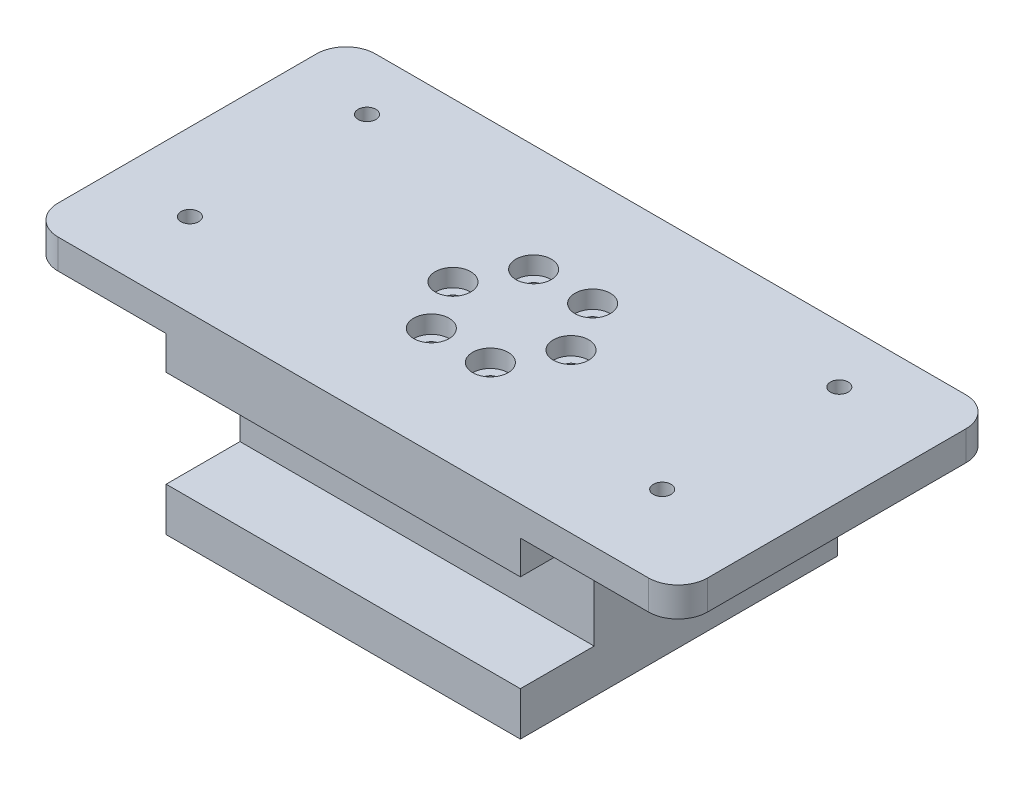
ISO-10303-21;
HEADER;
FILE_DESCRIPTION(('STEP AP214'),'2;1');
FILE_NAME('part.step','',(''),(''),'','','');
FILE_SCHEMA(('AUTOMOTIVE_DESIGN { 1 0 10303 214 1 1 1 1 }'));
ENDSEC;
DATA;
#1=APPLICATION_CONTEXT('core data for automotive mechanical design processes');
#2=APPLICATION_PROTOCOL_DEFINITION('international standard','automotive_design',2000,#1);
#3=PRODUCT_CONTEXT('',#1,'mechanical');
#4=PRODUCT('Part','Part','',(#3));
#5=PRODUCT_RELATED_PRODUCT_CATEGORY('part','',(#4));
#6=PRODUCT_DEFINITION_FORMATION('','',#4);
#7=PRODUCT_DEFINITION_CONTEXT('part definition',#1,'design');
#8=PRODUCT_DEFINITION('design','',#6,#7);
#9=PRODUCT_DEFINITION_SHAPE('','',#8);
#10=(LENGTH_UNIT() NAMED_UNIT(*) SI_UNIT(.MILLI.,.METRE.));
#11=(NAMED_UNIT(*) PLANE_ANGLE_UNIT() SI_UNIT($,.RADIAN.));
#12=(NAMED_UNIT(*) SI_UNIT($,.STERADIAN.) SOLID_ANGLE_UNIT());
#13=UNCERTAINTY_MEASURE_WITH_UNIT(LENGTH_MEASURE(1.E-05),#10,'distance_accuracy_value','');
#14=(GEOMETRIC_REPRESENTATION_CONTEXT(3) GLOBAL_UNCERTAINTY_ASSIGNED_CONTEXT((#13)) GLOBAL_UNIT_ASSIGNED_CONTEXT((#10,
#11,#12)) REPRESENTATION_CONTEXT('',''));
#15=CARTESIAN_POINT('',(0.,0.,0.));
#16=DIRECTION('',(0.,0.,1.));
#17=DIRECTION('',(1.,0.,0.));
#18=AXIS2_PLACEMENT_3D('',#15,#16,#17);
#19=CARTESIAN_POINT('',(0.,29.5,0.));
#20=DIRECTION('',(0.,0.,-1.));
#21=DIRECTION('',(-1.,0.,0.));
#22=AXIS2_PLACEMENT_3D('',#19,#20,#21);
#23=PLANE('',#22);
#24=DIRECTION('',(0.,-1.,0.));
#25=VECTOR('',#24,1.);
#26=CARTESIAN_POINT('',(60.0000000000001,29.5,0.));
#27=LINE('',#26,#25);
#28=CARTESIAN_POINT('',(60.0000000000001,7.40000000000001,0.));
#29=VERTEX_POINT('',#28);
#30=CARTESIAN_POINT('',(60.0000000000001,0.,0.));
#31=VERTEX_POINT('',#30);
#32=EDGE_CURVE('E300',#29,#31,#27,.T.);
#33=ORIENTED_EDGE('',*,*,#32,.F.);
#34=DIRECTION('',(-1.,0.,0.));
#35=VECTOR('',#34,1.);
#36=CARTESIAN_POINT('',(86.7070076840914,7.40000000000001,0.));
#37=LINE('',#36,#35);
#38=CARTESIAN_POINT('',(0.,7.40000000000001,0.));
#39=VERTEX_POINT('',#38);
#40=EDGE_CURVE('E329',#29,#39,#37,.T.);
#41=ORIENTED_EDGE('',*,*,#40,.T.);
#42=DIRECTION('',(0.,-1.,0.));
#43=VECTOR('',#42,1.);
#44=CARTESIAN_POINT('',(0.,29.5,0.));
#45=LINE('',#44,#43);
#46=CARTESIAN_POINT('',(0.,0.,0.));
#47=VERTEX_POINT('',#46);
#48=EDGE_CURVE('E189',#39,#47,#45,.T.);
#49=ORIENTED_EDGE('',*,*,#48,.T.);
#50=DIRECTION('',(1.,0.,0.));
#51=VECTOR('',#50,1.);
#52=CARTESIAN_POINT('',(0.,0.,0.));
#53=LINE('',#52,#51);
#54=EDGE_CURVE('E290',#47,#31,#53,.T.);
#55=ORIENTED_EDGE('',*,*,#54,.T.);
#56=EDGE_LOOP('',(#33,#41,#49,#55));
#57=FACE_BOUND('',#56,.T.);
#58=ADVANCED_FACE('F45',(#57),#23,.F.);
#59=CARTESIAN_POINT('',(0.,29.5,0.));
#60=DIRECTION('',(1.,0.,0.));
#61=DIRECTION('',(0.,0.,-1.));
#62=AXIS2_PLACEMENT_3D('',#59,#60,#61);
#63=PLANE('',#62);
#64=ORIENTED_EDGE('',*,*,#48,.F.);
#65=DIRECTION('',(0.,0.,1.));
#66=VECTOR('',#65,1.);
#67=CARTESIAN_POINT('',(0.,7.40000000000001,0.));
#68=LINE('',#67,#66);
#69=CARTESIAN_POINT('',(0.,7.4,-12.5));
#70=VERTEX_POINT('',#69);
#71=EDGE_CURVE('E170',#70,#39,#68,.T.);
#72=ORIENTED_EDGE('',*,*,#71,.F.);
#73=DIRECTION('',(0.,-1.,0.));
#74=VECTOR('',#73,1.);
#75=CARTESIAN_POINT('',(0.,23.8,-12.5));
#76=LINE('',#75,#74);
#77=CARTESIAN_POINT('',(0.,23.8,-12.5));
#78=VERTEX_POINT('',#77);
#79=EDGE_CURVE('E181',#78,#70,#76,.T.);
#80=ORIENTED_EDGE('',*,*,#79,.F.);
#81=DIRECTION('',(0.,0.,-1.));
#82=VECTOR('',#81,1.);
#83=CARTESIAN_POINT('',(0.,23.8,0.));
#84=LINE('',#83,#82);
#85=CARTESIAN_POINT('',(0.,23.8,0.));
#86=VERTEX_POINT('',#85);
#87=EDGE_CURVE('E162',#86,#78,#84,.T.);
#88=ORIENTED_EDGE('',*,*,#87,.F.);
#89=CARTESIAN_POINT('',(0.,29.5,0.));
#90=VERTEX_POINT('',#89);
#91=EDGE_CURVE('E177',#90,#86,#45,.T.);
#92=ORIENTED_EDGE('',*,*,#91,.F.);
#93=DIRECTION('',(0.,0.,1.));
#94=VECTOR('',#93,1.);
#95=CARTESIAN_POINT('',(0.,29.5,0.));
#96=LINE('',#95,#94);
#97=CARTESIAN_POINT('',(0.,29.5,-53.75));
#98=VERTEX_POINT('',#97);
#99=EDGE_CURVE('E268',#98,#90,#96,.T.);
#100=ORIENTED_EDGE('',*,*,#99,.F.);
#101=DIRECTION('',(0.,-1.,0.));
#102=VECTOR('',#101,1.);
#103=CARTESIAN_POINT('',(0.,29.5,-53.75));
#104=LINE('',#103,#102);
#105=CARTESIAN_POINT('',(0.,0.,-53.75));
#106=VERTEX_POINT('',#105);
#107=EDGE_CURVE('E286',#98,#106,#104,.T.);
#108=ORIENTED_EDGE('',*,*,#107,.T.);
#109=DIRECTION('',(0.,0.,1.));
#110=VECTOR('',#109,1.);
#111=CARTESIAN_POINT('',(0.,0.,0.));
#112=LINE('',#111,#110);
#113=EDGE_CURVE('E287',#106,#47,#112,.T.);
#114=ORIENTED_EDGE('',*,*,#113,.T.);
#115=EDGE_LOOP('',(#64,#72,#80,#88,#92,#100,#108,#114));
#116=FACE_BOUND('',#115,.T.);
#117=ADVANCED_FACE('F175',(#116),#63,.F.);
#118=DIRECTION('',(1.,0.,0.));
#119=VECTOR('',#118,1.);
#120=CARTESIAN_POINT('',(-23.2929923159086,29.5,0.));
#121=LINE('',#120,#119);
#122=CARTESIAN_POINT('',(60.0000000000001,29.5,0.));
#123=VERTEX_POINT('',#122);
#124=CARTESIAN_POINT('',(81.7070076840914,29.5,0.));
#125=VERTEX_POINT('',#124);
#126=EDGE_CURVE('E270',#123,#125,#121,.T.);
#127=ORIENTED_EDGE('',*,*,#126,.T.);
#128=DIRECTION('',(0.,-1.,0.));
#129=VECTOR('',#128,1.);
#130=CARTESIAN_POINT('',(81.7070076840914,29.5,0.));
#131=LINE('',#130,#129);
#132=CARTESIAN_POINT('',(81.7070076840914,34.5,0.));
#133=VERTEX_POINT('',#132);
#134=EDGE_CURVE('E11',#125,#133,#131,.F.);
#135=ORIENTED_EDGE('',*,*,#134,.T.);
#136=DIRECTION('',(1.,0.,0.));
#137=VECTOR('',#136,1.);
#138=CARTESIAN_POINT('',(-23.2929923159086,34.5,0.));
#139=LINE('',#138,#137);
#140=CARTESIAN_POINT('',(-18.2929923159086,34.5,0.));
#141=VERTEX_POINT('',#140);
#142=EDGE_CURVE('E260',#141,#133,#139,.T.);
#143=ORIENTED_EDGE('',*,*,#142,.F.);
#144=DIRECTION('',(0.,-1.,0.));
#145=VECTOR('',#144,1.);
#146=CARTESIAN_POINT('',(-18.2929923159086,29.5,0.));
#147=LINE('',#146,#145);
#148=CARTESIAN_POINT('',(-18.2929923159086,29.5,0.));
#149=VERTEX_POINT('',#148);
#150=EDGE_CURVE('E53',#141,#149,#147,.T.);
#151=ORIENTED_EDGE('',*,*,#150,.T.);
#152=EDGE_CURVE('E188',#149,#90,#121,.T.);
#153=ORIENTED_EDGE('',*,*,#152,.T.);
#154=ORIENTED_EDGE('',*,*,#91,.T.);
#155=DIRECTION('',(-1.,0.,0.));
#156=VECTOR('',#155,1.);
#157=CARTESIAN_POINT('',(86.7070076840914,23.8,0.));
#158=LINE('',#157,#156);
#159=CARTESIAN_POINT('',(60.0000000000001,23.8,0.));
#160=VERTEX_POINT('',#159);
#161=EDGE_CURVE('E159',#160,#86,#158,.T.);
#162=ORIENTED_EDGE('',*,*,#161,.F.);
#163=EDGE_CURVE('E193',#123,#160,#27,.T.);
#164=ORIENTED_EDGE('',*,*,#163,.F.);
#165=EDGE_LOOP('',(#127,#135,#143,#151,#153,#154,#162,#164));
#166=FACE_BOUND('',#165,.T.);
#167=ADVANCED_FACE('F185',(#166),#23,.F.);
#168=CARTESIAN_POINT('',(60.0000000000001,29.5,0.));
#169=DIRECTION('',(-1.,0.,0.));
#170=DIRECTION('',(0.,0.,1.));
#171=AXIS2_PLACEMENT_3D('',#168,#169,#170);
#172=PLANE('',#171);
#173=DIRECTION('',(0.,-1.,0.));
#174=VECTOR('',#173,1.);
#175=CARTESIAN_POINT('',(60.0000000000001,29.5,-12.5));
#176=LINE('',#175,#174);
#177=CARTESIAN_POINT('',(60.0000000000001,23.8,-12.5));
#178=VERTEX_POINT('',#177);
#179=CARTESIAN_POINT('',(60.0000000000001,7.4,-12.5));
#180=VERTEX_POINT('',#179);
#181=EDGE_CURVE('E191',#178,#180,#176,.T.);
#182=ORIENTED_EDGE('',*,*,#181,.T.);
#183=DIRECTION('',(0.,0.,1.));
#184=VECTOR('',#183,1.);
#185=CARTESIAN_POINT('',(60.0000000000001,7.4,0.));
#186=LINE('',#185,#184);
#187=EDGE_CURVE('E199',#180,#29,#186,.T.);
#188=ORIENTED_EDGE('',*,*,#187,.T.);
#189=ORIENTED_EDGE('',*,*,#32,.T.);
#190=DIRECTION('',(0.,0.,-1.));
#191=VECTOR('',#190,1.);
#192=CARTESIAN_POINT('',(60.0000000000001,0.,0.));
#193=LINE('',#192,#191);
#194=CARTESIAN_POINT('',(60.0000000000001,0.,-53.75));
#195=VERTEX_POINT('',#194);
#196=EDGE_CURVE('E294',#31,#195,#193,.T.);
#197=ORIENTED_EDGE('',*,*,#196,.T.);
#198=DIRECTION('',(0.,-1.,0.));
#199=VECTOR('',#198,1.);
#200=CARTESIAN_POINT('',(60.0000000000001,29.5,-53.75));
#201=LINE('',#200,#199);
#202=CARTESIAN_POINT('',(60.0000000000001,29.5,-53.75));
#203=VERTEX_POINT('',#202);
#204=EDGE_CURVE('E298',#203,#195,#201,.T.);
#205=ORIENTED_EDGE('',*,*,#204,.F.);
#206=DIRECTION('',(0.,0.,-1.));
#207=VECTOR('',#206,1.);
#208=CARTESIAN_POINT('',(60.0000000000001,29.5,0.));
#209=LINE('',#208,#207);
#210=EDGE_CURVE('E282',#123,#203,#209,.T.);
#211=ORIENTED_EDGE('',*,*,#210,.F.);
#212=ORIENTED_EDGE('',*,*,#163,.T.);
#213=DIRECTION('',(0.,0.,-1.));
#214=VECTOR('',#213,1.);
#215=CARTESIAN_POINT('',(60.0000000000001,23.8,0.));
#216=LINE('',#215,#214);
#217=EDGE_CURVE('E165',#160,#178,#216,.T.);
#218=ORIENTED_EDGE('',*,*,#217,.T.);
#219=EDGE_LOOP('',(#182,#188,#189,#197,#205,#211,#212,#218));
#220=FACE_BOUND('',#219,.T.);
#221=ADVANCED_FACE('F307',(#220),#172,.F.);
#222=CARTESIAN_POINT('',(0.,29.5,-53.75));
#223=DIRECTION('',(0.,0.,1.));
#224=DIRECTION('',(1.,0.,0.));
#225=AXIS2_PLACEMENT_3D('',#222,#223,#224);
#226=PLANE('',#225);
#227=DIRECTION('',(-1.,0.,0.));
#228=VECTOR('',#227,1.);
#229=CARTESIAN_POINT('',(-23.2929923159086,29.5,-53.75));
#230=LINE('',#229,#228);
#231=CARTESIAN_POINT('',(-18.2929923159086,29.5,-53.75));
#232=VERTEX_POINT('',#231);
#233=EDGE_CURVE('E272',#98,#232,#230,.T.);
#234=ORIENTED_EDGE('',*,*,#233,.T.);
#235=DIRECTION('',(0.,-1.,0.));
#236=VECTOR('',#235,1.);
#237=CARTESIAN_POINT('',(-18.2929923159086,29.5,-53.75));
#238=LINE('',#237,#236);
#239=CARTESIAN_POINT('',(-18.2929923159086,34.5,-53.75));
#240=VERTEX_POINT('',#239);
#241=EDGE_CURVE('E242',#232,#240,#238,.F.);
#242=ORIENTED_EDGE('',*,*,#241,.T.);
#243=DIRECTION('',(-1.,0.,0.));
#244=VECTOR('',#243,1.);
#245=CARTESIAN_POINT('',(-23.2929923159086,34.5,-53.75));
#246=LINE('',#245,#244);
#247=CARTESIAN_POINT('',(81.7070076840914,34.5,-53.75));
#248=VERTEX_POINT('',#247);
#249=EDGE_CURVE('E291',#248,#240,#246,.T.);
#250=ORIENTED_EDGE('',*,*,#249,.F.);
#251=DIRECTION('',(0.,-1.,0.));
#252=VECTOR('',#251,1.);
#253=CARTESIAN_POINT('',(81.7070076840914,29.5,-53.75));
#254=LINE('',#253,#252);
#255=CARTESIAN_POINT('',(81.7070076840914,29.5,-53.75));
#256=VERTEX_POINT('',#255);
#257=EDGE_CURVE('E239',#248,#256,#254,.T.);
#258=ORIENTED_EDGE('',*,*,#257,.T.);
#259=EDGE_CURVE('E278',#256,#203,#230,.T.);
#260=ORIENTED_EDGE('',*,*,#259,.T.);
#261=ORIENTED_EDGE('',*,*,#204,.T.);
#262=DIRECTION('',(-1.,0.,0.));
#263=VECTOR('',#262,1.);
#264=CARTESIAN_POINT('',(0.,0.,-53.75));
#265=LINE('',#264,#263);
#266=EDGE_CURVE('E283',#195,#106,#265,.T.);
#267=ORIENTED_EDGE('',*,*,#266,.T.);
#268=ORIENTED_EDGE('',*,*,#107,.F.);
#269=EDGE_LOOP('',(#234,#242,#250,#258,#260,#261,#267,#268));
#270=FACE_BOUND('',#269,.T.);
#271=ADVANCED_FACE('F434',(#270),#226,.F.);
#272=CARTESIAN_POINT('',(0.,0.,0.));
#273=DIRECTION('',(0.,-1.,0.));
#274=DIRECTION('',(0.,0.,-1.));
#275=AXIS2_PLACEMENT_3D('',#272,#273,#274);
#276=PLANE('',#275);
#277=CARTESIAN_POINT('',(41.7070076840914,0.,-26.875));
#278=DIRECTION('',(0.,1.,0.));
#279=DIRECTION('',(0.,0.,1.));
#280=AXIS2_PLACEMENT_3D('',#277,#278,#279);
#281=CIRCLE('',#280,1.5);
#282=CARTESIAN_POINT('',(41.7070076840914,0.,-25.375));
#283=VERTEX_POINT('',#282);
#284=EDGE_CURVE('E215',#283,#283,#281,.T.);
#285=ORIENTED_EDGE('',*,*,#284,.T.);
#286=EDGE_LOOP('',(#285));
#287=FACE_BOUND('',#286,.T.);
#288=CARTESIAN_POINT('',(36.7070076840915,0.,-35.5352540378443));
#289=DIRECTION('',(0.,1.,0.));
#290=DIRECTION('',(0.,0.,1.));
#291=AXIS2_PLACEMENT_3D('',#288,#289,#290);
#292=CIRCLE('',#291,1.49999999999999);
#293=CARTESIAN_POINT('',(36.7070076840915,0.,-34.0352540378443));
#294=VERTEX_POINT('',#293);
#295=EDGE_CURVE('E388',#294,#294,#292,.T.);
#296=ORIENTED_EDGE('',*,*,#295,.T.);
#297=EDGE_LOOP('',(#296));
#298=FACE_BOUND('',#297,.T.);
#299=CARTESIAN_POINT('',(26.7070076840915,0.,-35.5352540378444));
#300=DIRECTION('',(0.,1.,0.));
#301=DIRECTION('',(0.,0.,1.));
#302=AXIS2_PLACEMENT_3D('',#299,#300,#301);
#303=CIRCLE('',#302,1.5);
#304=CARTESIAN_POINT('',(26.7070076840915,0.,-34.0352540378444));
#305=VERTEX_POINT('',#304);
#306=EDGE_CURVE('E384',#305,#305,#303,.T.);
#307=ORIENTED_EDGE('',*,*,#306,.T.);
#308=EDGE_LOOP('',(#307));
#309=FACE_BOUND('',#308,.T.);
#310=CARTESIAN_POINT('',(21.7070076840914,0.,-26.8750000000001));
#311=DIRECTION('',(0.,1.,0.));
#312=DIRECTION('',(0.,0.,1.));
#313=AXIS2_PLACEMENT_3D('',#310,#311,#312);
#314=CIRCLE('',#313,1.5);
#315=CARTESIAN_POINT('',(21.7070076840914,0.,-25.3750000000001));
#316=VERTEX_POINT('',#315);
#317=EDGE_CURVE('E387',#316,#316,#314,.T.);
#318=ORIENTED_EDGE('',*,*,#317,.T.);
#319=EDGE_LOOP('',(#318));
#320=FACE_BOUND('',#319,.T.);
#321=CARTESIAN_POINT('',(26.7070076840914,0.,-18.2147459621556));
#322=DIRECTION('',(0.,1.,0.));
#323=DIRECTION('',(0.,0.,1.));
#324=AXIS2_PLACEMENT_3D('',#321,#322,#323);
#325=CIRCLE('',#324,1.5);
#326=CARTESIAN_POINT('',(26.7070076840914,0.,-16.7147459621556));
#327=VERTEX_POINT('',#326);
#328=EDGE_CURVE('E391',#327,#327,#325,.T.);
#329=ORIENTED_EDGE('',*,*,#328,.T.);
#330=EDGE_LOOP('',(#329));
#331=FACE_BOUND('',#330,.T.);
#332=CARTESIAN_POINT('',(36.7070076840914,0.,-18.2147459621556));
#333=DIRECTION('',(0.,1.,0.));
#334=DIRECTION('',(0.,0.,1.));
#335=AXIS2_PLACEMENT_3D('',#332,#333,#334);
#336=CIRCLE('',#335,1.50000000000001);
#337=CARTESIAN_POINT('',(36.7070076840914,0.,-16.7147459621556));
#338=VERTEX_POINT('',#337);
#339=EDGE_CURVE('E394',#338,#338,#336,.T.);
#340=ORIENTED_EDGE('',*,*,#339,.T.);
#341=EDGE_LOOP('',(#340));
#342=FACE_BOUND('',#341,.T.);
#343=ORIENTED_EDGE('',*,*,#113,.F.);
#344=ORIENTED_EDGE('',*,*,#266,.F.);
#345=ORIENTED_EDGE('',*,*,#196,.F.);
#346=ORIENTED_EDGE('',*,*,#54,.F.);
#347=EDGE_LOOP('',(#343,#344,#345,#346));
#348=FACE_BOUND('',#347,.T.);
#349=ADVANCED_FACE('F402',(#287,#298,#309,#320,#331,#342,#348),#276,.T.);
#350=CARTESIAN_POINT('',(0.,29.5,0.));
#351=DIRECTION('',(0.,-1.,0.));
#352=DIRECTION('',(0.,0.,-1.));
#353=AXIS2_PLACEMENT_3D('',#350,#351,#352);
#354=PLANE('',#353);
#355=CARTESIAN_POINT('',(-10.1329923159087,29.5,-44.155));
#356=DIRECTION('',(0.,-1.,0.));
#357=DIRECTION('',(0.,0.,-1.));
#358=AXIS2_PLACEMENT_3D('',#355,#356,#357);
#359=CIRCLE('',#358,1.5);
#360=CARTESIAN_POINT('',(-10.1329923159087,29.5,-45.655));
#361=VERTEX_POINT('',#360);
#362=EDGE_CURVE('E182',#361,#361,#359,.T.);
#363=ORIENTED_EDGE('',*,*,#362,.F.);
#364=EDGE_LOOP('',(#363));
#365=FACE_BOUND('',#364,.T.);
#366=CARTESIAN_POINT('',(-10.1329923159086,29.5,-14.155));
#367=DIRECTION('',(0.,-1.,0.));
#368=DIRECTION('',(0.,0.,-1.));
#369=AXIS2_PLACEMENT_3D('',#366,#367,#368);
#370=CIRCLE('',#369,1.5);
#371=CARTESIAN_POINT('',(-10.1329923159086,29.5,-15.655));
#372=VERTEX_POINT('',#371);
#373=EDGE_CURVE('E210',#372,#372,#370,.T.);
#374=ORIENTED_EDGE('',*,*,#373,.F.);
#375=EDGE_LOOP('',(#374));
#376=FACE_BOUND('',#375,.T.);
#377=DIRECTION('',(0.,0.,1.));
#378=VECTOR('',#377,1.);
#379=CARTESIAN_POINT('',(-23.2929923159086,29.5,0.));
#380=LINE('',#379,#378);
#381=CARTESIAN_POINT('',(-23.2929923159086,29.5,-48.75));
#382=VERTEX_POINT('',#381);
#383=CARTESIAN_POINT('',(-23.2929923159086,29.5,-5.));
#384=VERTEX_POINT('',#383);
#385=EDGE_CURVE('E274',#382,#384,#380,.T.);
#386=ORIENTED_EDGE('',*,*,#385,.F.);
#387=CARTESIAN_POINT('',(-18.2929923159086,29.5,-48.75));
#388=DIRECTION('',(0.,-1.,0.));
#389=DIRECTION('',(0.,0.,-1.));
#390=AXIS2_PLACEMENT_3D('',#387,#388,#389);
#391=CIRCLE('',#390,5.);
#392=EDGE_CURVE('E237',#382,#232,#391,.T.);
#393=ORIENTED_EDGE('',*,*,#392,.T.);
#394=ORIENTED_EDGE('',*,*,#233,.F.);
#395=ORIENTED_EDGE('',*,*,#99,.T.);
#396=ORIENTED_EDGE('',*,*,#152,.F.);
#397=CARTESIAN_POINT('',(-18.2929923159086,29.5,-5.));
#398=DIRECTION('',(0.,-1.,0.));
#399=DIRECTION('',(0.,0.,-1.));
#400=AXIS2_PLACEMENT_3D('',#397,#398,#399);
#401=CIRCLE('',#400,5.);
#402=EDGE_CURVE('E235',#149,#384,#401,.T.);
#403=ORIENTED_EDGE('',*,*,#402,.T.);
#404=EDGE_LOOP('',(#386,#393,#394,#395,#396,#403));
#405=FACE_BOUND('',#404,.T.);
#406=ADVANCED_FACE('F265',(#365,#376,#405),#354,.T.);
#407=CARTESIAN_POINT('',(-23.2929923159086,34.5,0.));
#408=DIRECTION('',(1.,0.,0.));
#409=DIRECTION('',(0.,0.,-1.));
#410=AXIS2_PLACEMENT_3D('',#407,#408,#409);
#411=PLANE('',#410);
#412=DIRECTION('',(0.,0.,1.));
#413=VECTOR('',#412,1.);
#414=CARTESIAN_POINT('',(-23.2929923159086,34.5,0.));
#415=LINE('',#414,#413);
#416=CARTESIAN_POINT('',(-23.2929923159086,34.5,-48.75));
#417=VERTEX_POINT('',#416);
#418=CARTESIAN_POINT('',(-23.2929923159086,34.5,-5.));
#419=VERTEX_POINT('',#418);
#420=EDGE_CURVE('E280',#417,#419,#415,.T.);
#421=ORIENTED_EDGE('',*,*,#420,.F.);
#422=DIRECTION('',(0.,-1.,0.));
#423=VECTOR('',#422,1.);
#424=CARTESIAN_POINT('',(-23.2929923159086,34.5,-48.75));
#425=LINE('',#424,#423);
#426=EDGE_CURVE('E232',#417,#382,#425,.T.);
#427=ORIENTED_EDGE('',*,*,#426,.T.);
#428=ORIENTED_EDGE('',*,*,#385,.T.);
#429=DIRECTION('',(0.,-1.,0.));
#430=VECTOR('',#429,1.);
#431=CARTESIAN_POINT('',(-23.2929923159086,34.5,-5.));
#432=LINE('',#431,#430);
#433=EDGE_CURVE('E202',#384,#419,#432,.F.);
#434=ORIENTED_EDGE('',*,*,#433,.T.);
#435=EDGE_LOOP('',(#421,#427,#428,#434));
#436=FACE_BOUND('',#435,.T.);
#437=ADVANCED_FACE('F442',(#436),#411,.F.);
#438=CARTESIAN_POINT('',(86.7070076840914,34.5,0.));
#439=DIRECTION('',(-1.,0.,0.));
#440=DIRECTION('',(0.,0.,1.));
#441=AXIS2_PLACEMENT_3D('',#438,#439,#440);
#442=PLANE('',#441);
#443=DIRECTION('',(0.,0.,-1.));
#444=VECTOR('',#443,1.);
#445=CARTESIAN_POINT('',(86.7070076840914,29.5,0.));
#446=LINE('',#445,#444);
#447=CARTESIAN_POINT('',(86.7070076840914,29.5,-5.));
#448=VERTEX_POINT('',#447);
#449=CARTESIAN_POINT('',(86.7070076840914,29.5,-48.75));
#450=VERTEX_POINT('',#449);
#451=EDGE_CURVE('E269',#448,#450,#446,.T.);
#452=ORIENTED_EDGE('',*,*,#451,.T.);
#453=DIRECTION('',(0.,-1.,0.));
#454=VECTOR('',#453,1.);
#455=CARTESIAN_POINT('',(86.7070076840914,34.5,-48.75));
#456=LINE('',#455,#454);
#457=CARTESIAN_POINT('',(86.7070076840914,34.5,-48.75));
#458=VERTEX_POINT('',#457);
#459=EDGE_CURVE('E256',#450,#458,#456,.F.);
#460=ORIENTED_EDGE('',*,*,#459,.T.);
#461=DIRECTION('',(0.,0.,-1.));
#462=VECTOR('',#461,1.);
#463=CARTESIAN_POINT('',(86.7070076840914,34.5,0.));
#464=LINE('',#463,#462);
#465=CARTESIAN_POINT('',(86.7070076840914,34.5,-5.));
#466=VERTEX_POINT('',#465);
#467=EDGE_CURVE('E316',#466,#458,#464,.T.);
#468=ORIENTED_EDGE('',*,*,#467,.F.);
#469=DIRECTION('',(0.,-1.,0.));
#470=VECTOR('',#469,1.);
#471=CARTESIAN_POINT('',(86.7070076840914,34.5,-5.));
#472=LINE('',#471,#470);
#473=EDGE_CURVE('E254',#466,#448,#472,.T.);
#474=ORIENTED_EDGE('',*,*,#473,.T.);
#475=EDGE_LOOP('',(#452,#460,#468,#474));
#476=FACE_BOUND('',#475,.T.);
#477=ADVANCED_FACE('F319',(#476),#442,.F.);
#478=CARTESIAN_POINT('',(0.,34.5,0.));
#479=DIRECTION('',(0.,-1.,0.));
#480=DIRECTION('',(0.,0.,-1.));
#481=AXIS2_PLACEMENT_3D('',#478,#479,#480);
#482=PLANE('',#481);
#483=CARTESIAN_POINT('',(36.7070076840914,34.5,-18.2147459621556));
#484=DIRECTION('',(0.,1.,0.));
#485=DIRECTION('',(0.,0.,1.));
#486=AXIS2_PLACEMENT_3D('',#483,#484,#485);
#487=CIRCLE('',#486,3.);
#488=CARTESIAN_POINT('',(36.7070076840914,34.5,-15.2147459621556));
#489=VERTEX_POINT('',#488);
#490=EDGE_CURVE('E353',#489,#489,#487,.T.);
#491=ORIENTED_EDGE('',*,*,#490,.F.);
#492=EDGE_LOOP('',(#491));
#493=FACE_BOUND('',#492,.T.);
#494=CARTESIAN_POINT('',(26.7070076840914,34.5,-18.2147459621556));
#495=DIRECTION('',(0.,1.,0.));
#496=DIRECTION('',(0.,0.,1.));
#497=AXIS2_PLACEMENT_3D('',#494,#495,#496);
#498=CIRCLE('',#497,3.);
#499=CARTESIAN_POINT('',(26.7070076840914,34.5,-15.2147459621556));
#500=VERTEX_POINT('',#499);
#501=EDGE_CURVE('E372',#500,#500,#498,.T.);
#502=ORIENTED_EDGE('',*,*,#501,.F.);
#503=EDGE_LOOP('',(#502));
#504=FACE_BOUND('',#503,.T.);
#505=CARTESIAN_POINT('',(21.7070076840914,34.5,-26.875));
#506=DIRECTION('',(0.,1.,0.));
#507=DIRECTION('',(0.,0.,1.));
#508=AXIS2_PLACEMENT_3D('',#505,#506,#507);
#509=CIRCLE('',#508,3.);
#510=CARTESIAN_POINT('',(21.7070076840914,34.5,-23.875));
#511=VERTEX_POINT('',#510);
#512=EDGE_CURVE('E366',#511,#511,#509,.T.);
#513=ORIENTED_EDGE('',*,*,#512,.F.);
#514=EDGE_LOOP('',(#513));
#515=FACE_BOUND('',#514,.T.);
#516=CARTESIAN_POINT('',(26.7070076840914,34.5,-35.5352540378444));
#517=DIRECTION('',(0.,1.,0.));
#518=DIRECTION('',(0.,0.,1.));
#519=AXIS2_PLACEMENT_3D('',#516,#517,#518);
#520=CIRCLE('',#519,3.);
#521=CARTESIAN_POINT('',(26.7070076840914,34.5,-32.5352540378444));
#522=VERTEX_POINT('',#521);
#523=EDGE_CURVE('E359',#522,#522,#520,.T.);
#524=ORIENTED_EDGE('',*,*,#523,.F.);
#525=EDGE_LOOP('',(#524));
#526=FACE_BOUND('',#525,.T.);
#527=CARTESIAN_POINT('',(36.7070076840914,34.5,-35.5352540378444));
#528=DIRECTION('',(0.,1.,0.));
#529=DIRECTION('',(0.,0.,1.));
#530=AXIS2_PLACEMENT_3D('',#527,#528,#529);
#531=CIRCLE('',#530,3.);
#532=CARTESIAN_POINT('',(36.7070076840914,34.5,-32.5352540378444));
#533=VERTEX_POINT('',#532);
#534=EDGE_CURVE('E360',#533,#533,#531,.T.);
#535=ORIENTED_EDGE('',*,*,#534,.F.);
#536=EDGE_LOOP('',(#535));
#537=FACE_BOUND('',#536,.T.);
#538=CARTESIAN_POINT('',(41.7070076840914,34.5,-26.875));
#539=DIRECTION('',(0.,1.,0.));
#540=DIRECTION('',(0.,0.,1.));
#541=AXIS2_PLACEMENT_3D('',#538,#539,#540);
#542=CIRCLE('',#541,3.);
#543=CARTESIAN_POINT('',(41.7070076840914,34.5,-23.875));
#544=VERTEX_POINT('',#543);
#545=EDGE_CURVE('E350',#544,#544,#542,.T.);
#546=ORIENTED_EDGE('',*,*,#545,.F.);
#547=EDGE_LOOP('',(#546));
#548=FACE_BOUND('',#547,.T.);
#549=CARTESIAN_POINT('',(69.8670076840914,34.5,-14.155));
#550=DIRECTION('',(0.,1.,0.));
#551=DIRECTION('',(0.,0.,1.));
#552=AXIS2_PLACEMENT_3D('',#549,#550,#551);
#553=CIRCLE('',#552,1.50000000000001);
#554=CARTESIAN_POINT('',(69.8670076840914,34.5,-12.655));
#555=VERTEX_POINT('',#554);
#556=EDGE_CURVE('E340',#555,#555,#553,.T.);
#557=ORIENTED_EDGE('',*,*,#556,.F.);
#558=EDGE_LOOP('',(#557));
#559=FACE_BOUND('',#558,.T.);
#560=CARTESIAN_POINT('',(-10.1329923159087,34.5,-44.155));
#561=DIRECTION('',(0.,1.,0.));
#562=DIRECTION('',(0.,0.,1.));
#563=AXIS2_PLACEMENT_3D('',#560,#561,#562);
#564=CIRCLE('',#563,1.5);
#565=CARTESIAN_POINT('',(-10.1329923159087,34.5,-42.655));
#566=VERTEX_POINT('',#565);
#567=EDGE_CURVE('E341',#566,#566,#564,.T.);
#568=ORIENTED_EDGE('',*,*,#567,.F.);
#569=EDGE_LOOP('',(#568));
#570=FACE_BOUND('',#569,.T.);
#571=CARTESIAN_POINT('',(69.8670076840913,34.5,-44.155));
#572=DIRECTION('',(0.,1.,0.));
#573=DIRECTION('',(0.,0.,1.));
#574=AXIS2_PLACEMENT_3D('',#571,#572,#573);
#575=CIRCLE('',#574,1.50000000000001);
#576=CARTESIAN_POINT('',(69.8670076840913,34.5,-42.655));
#577=VERTEX_POINT('',#576);
#578=EDGE_CURVE('E344',#577,#577,#575,.T.);
#579=ORIENTED_EDGE('',*,*,#578,.F.);
#580=EDGE_LOOP('',(#579));
#581=FACE_BOUND('',#580,.T.);
#582=CARTESIAN_POINT('',(-10.1329923159086,34.5,-14.155));
#583=DIRECTION('',(0.,1.,0.));
#584=DIRECTION('',(0.,0.,1.));
#585=AXIS2_PLACEMENT_3D('',#582,#583,#584);
#586=CIRCLE('',#585,1.5);
#587=CARTESIAN_POINT('',(-10.1329923159086,34.5,-12.655));
#588=VERTEX_POINT('',#587);
#589=EDGE_CURVE('E207',#588,#588,#586,.T.);
#590=ORIENTED_EDGE('',*,*,#589,.F.);
#591=EDGE_LOOP('',(#590));
#592=FACE_BOUND('',#591,.T.);
#593=ORIENTED_EDGE('',*,*,#249,.T.);
#594=CARTESIAN_POINT('',(-18.2929923159086,34.5,-48.75));
#595=DIRECTION('',(0.,-1.,0.));
#596=DIRECTION('',(0.,0.,-1.));
#597=AXIS2_PLACEMENT_3D('',#594,#595,#596);
#598=CIRCLE('',#597,5.);
#599=EDGE_CURVE('E250',#240,#417,#598,.F.);
#600=ORIENTED_EDGE('',*,*,#599,.T.);
#601=ORIENTED_EDGE('',*,*,#420,.T.);
#602=CARTESIAN_POINT('',(-18.2929923159086,34.5,-5.));
#603=DIRECTION('',(0.,-1.,0.));
#604=DIRECTION('',(0.,0.,-1.));
#605=AXIS2_PLACEMENT_3D('',#602,#603,#604);
#606=CIRCLE('',#605,5.);
#607=EDGE_CURVE('E244',#419,#141,#606,.F.);
#608=ORIENTED_EDGE('',*,*,#607,.T.);
#609=ORIENTED_EDGE('',*,*,#142,.T.);
#610=CARTESIAN_POINT('',(81.7070076840914,34.5,-5.));
#611=DIRECTION('',(0.,-1.,0.));
#612=DIRECTION('',(0.,0.,-1.));
#613=AXIS2_PLACEMENT_3D('',#610,#611,#612);
#614=CIRCLE('',#613,5.);
#615=EDGE_CURVE('E246',#133,#466,#614,.F.);
#616=ORIENTED_EDGE('',*,*,#615,.T.);
#617=ORIENTED_EDGE('',*,*,#467,.T.);
#618=CARTESIAN_POINT('',(81.7070076840914,34.5,-48.75));
#619=DIRECTION('',(0.,-1.,0.));
#620=DIRECTION('',(0.,0.,-1.));
#621=AXIS2_PLACEMENT_3D('',#618,#619,#620);
#622=CIRCLE('',#621,5.);
#623=EDGE_CURVE('E248',#458,#248,#622,.F.);
#624=ORIENTED_EDGE('',*,*,#623,.T.);
#625=EDGE_LOOP('',(#593,#600,#601,#608,#609,#616,#617,#624));
#626=FACE_BOUND('',#625,.T.);
#627=ADVANCED_FACE('F315',(#493,#504,#515,#526,#537,#548,#559,#570,#581,#592,#626),#482,.F.);
#628=CARTESIAN_POINT('',(69.8670076840914,29.5,-14.155));
#629=DIRECTION('',(0.,-1.,0.));
#630=DIRECTION('',(0.,0.,-1.));
#631=AXIS2_PLACEMENT_3D('',#628,#629,#630);
#632=CIRCLE('',#631,1.50000000000001);
#633=CARTESIAN_POINT('',(69.8670076840914,29.5,-15.655));
#634=VERTEX_POINT('',#633);
#635=EDGE_CURVE('E206',#634,#634,#632,.T.);
#636=ORIENTED_EDGE('',*,*,#635,.F.);
#637=EDGE_LOOP('',(#636));
#638=FACE_BOUND('',#637,.T.);
#639=CARTESIAN_POINT('',(69.8670076840913,29.5,-44.155));
#640=DIRECTION('',(0.,-1.,0.));
#641=DIRECTION('',(0.,0.,-1.));
#642=AXIS2_PLACEMENT_3D('',#639,#640,#641);
#643=CIRCLE('',#642,1.50000000000001);
#644=CARTESIAN_POINT('',(69.8670076840913,29.5,-45.655));
#645=VERTEX_POINT('',#644);
#646=EDGE_CURVE('E203',#645,#645,#643,.T.);
#647=ORIENTED_EDGE('',*,*,#646,.F.);
#648=EDGE_LOOP('',(#647));
#649=FACE_BOUND('',#648,.T.);
#650=ORIENTED_EDGE('',*,*,#259,.F.);
#651=CARTESIAN_POINT('',(81.7070076840914,29.5,-48.75));
#652=DIRECTION('',(0.,-1.,0.));
#653=DIRECTION('',(0.,0.,-1.));
#654=AXIS2_PLACEMENT_3D('',#651,#652,#653);
#655=CIRCLE('',#654,5.);
#656=EDGE_CURVE('E60',#256,#450,#655,.T.);
#657=ORIENTED_EDGE('',*,*,#656,.T.);
#658=ORIENTED_EDGE('',*,*,#451,.F.);
#659=CARTESIAN_POINT('',(81.7070076840914,29.5,-5.));
#660=DIRECTION('',(0.,-1.,0.));
#661=DIRECTION('',(0.,0.,-1.));
#662=AXIS2_PLACEMENT_3D('',#659,#660,#661);
#663=CIRCLE('',#662,5.);
#664=EDGE_CURVE('E68',#448,#125,#663,.T.);
#665=ORIENTED_EDGE('',*,*,#664,.T.);
#666=ORIENTED_EDGE('',*,*,#126,.F.);
#667=ORIENTED_EDGE('',*,*,#210,.T.);
#668=EDGE_LOOP('',(#650,#657,#658,#665,#666,#667));
#669=FACE_BOUND('',#668,.T.);
#670=ADVANCED_FACE('F448',(#638,#649,#669),#354,.T.);
#671=CARTESIAN_POINT('',(86.7070076840914,7.40000000000001,0.));
#672=DIRECTION('',(0.,-1.,0.));
#673=DIRECTION('',(0.,0.,-1.));
#674=AXIS2_PLACEMENT_3D('',#671,#672,#673);
#675=PLANE('',#674);
#676=DIRECTION('',(-1.,0.,0.));
#677=VECTOR('',#676,1.);
#678=CARTESIAN_POINT('',(86.7070076840914,7.4,-12.5));
#679=LINE('',#678,#677);
#680=EDGE_CURVE('E327',#180,#70,#679,.T.);
#681=ORIENTED_EDGE('',*,*,#680,.T.);
#682=ORIENTED_EDGE('',*,*,#71,.T.);
#683=ORIENTED_EDGE('',*,*,#40,.F.);
#684=ORIENTED_EDGE('',*,*,#187,.F.);
#685=EDGE_LOOP('',(#681,#682,#683,#684));
#686=FACE_BOUND('',#685,.T.);
#687=ADVANCED_FACE('F451',(#686),#675,.F.);
#688=CARTESIAN_POINT('',(86.7070076840914,23.8,-12.5));
#689=DIRECTION('',(0.,0.,-1.));
#690=DIRECTION('',(-1.,0.,0.));
#691=AXIS2_PLACEMENT_3D('',#688,#689,#690);
#692=PLANE('',#691);
#693=DIRECTION('',(-1.,0.,0.));
#694=VECTOR('',#693,1.);
#695=CARTESIAN_POINT('',(86.7070076840914,23.8,-12.5));
#696=LINE('',#695,#694);
#697=EDGE_CURVE('E169',#178,#78,#696,.T.);
#698=ORIENTED_EDGE('',*,*,#697,.T.);
#699=ORIENTED_EDGE('',*,*,#79,.T.);
#700=ORIENTED_EDGE('',*,*,#680,.F.);
#701=ORIENTED_EDGE('',*,*,#181,.F.);
#702=EDGE_LOOP('',(#698,#699,#700,#701));
#703=FACE_BOUND('',#702,.T.);
#704=ADVANCED_FACE('F459',(#703),#692,.F.);
#705=CARTESIAN_POINT('',(86.7070076840914,23.8,0.));
#706=DIRECTION('',(0.,1.,0.));
#707=DIRECTION('',(0.,0.,1.));
#708=AXIS2_PLACEMENT_3D('',#705,#706,#707);
#709=PLANE('',#708);
#710=ORIENTED_EDGE('',*,*,#161,.T.);
#711=ORIENTED_EDGE('',*,*,#87,.T.);
#712=ORIENTED_EDGE('',*,*,#697,.F.);
#713=ORIENTED_EDGE('',*,*,#217,.F.);
#714=EDGE_LOOP('',(#710,#711,#712,#713));
#715=FACE_BOUND('',#714,.T.);
#716=ADVANCED_FACE('F161',(#715),#709,.F.);
#717=CARTESIAN_POINT('',(69.8670076840913,0.,-44.155));
#718=DIRECTION('',(0.,1.,0.));
#719=DIRECTION('',(0.,0.,1.));
#720=AXIS2_PLACEMENT_3D('',#717,#718,#719);
#721=CYLINDRICAL_SURFACE('',#720,1.50000000000001);
#722=ORIENTED_EDGE('',*,*,#646,.T.);
#723=EDGE_LOOP('',(#722));
#724=FACE_BOUND('',#723,.T.);
#725=ORIENTED_EDGE('',*,*,#578,.T.);
#726=EDGE_LOOP('',(#725));
#727=FACE_BOUND('',#726,.T.);
#728=ADVANCED_FACE('F458',(#724,#727),#721,.F.);
#729=CARTESIAN_POINT('',(69.8670076840914,0.,-14.155));
#730=DIRECTION('',(0.,1.,0.));
#731=DIRECTION('',(0.,0.,1.));
#732=AXIS2_PLACEMENT_3D('',#729,#730,#731);
#733=CYLINDRICAL_SURFACE('',#732,1.50000000000001);
#734=ORIENTED_EDGE('',*,*,#635,.T.);
#735=EDGE_LOOP('',(#734));
#736=FACE_BOUND('',#735,.T.);
#737=ORIENTED_EDGE('',*,*,#556,.T.);
#738=EDGE_LOOP('',(#737));
#739=FACE_BOUND('',#738,.T.);
#740=ADVANCED_FACE('F469',(#736,#739),#733,.F.);
#741=CARTESIAN_POINT('',(-10.1329923159086,0.,-14.155));
#742=DIRECTION('',(0.,1.,0.));
#743=DIRECTION('',(0.,0.,1.));
#744=AXIS2_PLACEMENT_3D('',#741,#742,#743);
#745=CYLINDRICAL_SURFACE('',#744,1.5);
#746=ORIENTED_EDGE('',*,*,#373,.T.);
#747=EDGE_LOOP('',(#746));
#748=FACE_BOUND('',#747,.T.);
#749=ORIENTED_EDGE('',*,*,#589,.T.);
#750=EDGE_LOOP('',(#749));
#751=FACE_BOUND('',#750,.T.);
#752=ADVANCED_FACE('F465',(#748,#751),#745,.F.);
#753=CARTESIAN_POINT('',(-10.1329923159087,0.,-44.155));
#754=DIRECTION('',(0.,1.,0.));
#755=DIRECTION('',(0.,0.,1.));
#756=AXIS2_PLACEMENT_3D('',#753,#754,#755);
#757=CYLINDRICAL_SURFACE('',#756,1.5);
#758=ORIENTED_EDGE('',*,*,#362,.T.);
#759=EDGE_LOOP('',(#758));
#760=FACE_BOUND('',#759,.T.);
#761=ORIENTED_EDGE('',*,*,#567,.T.);
#762=EDGE_LOOP('',(#761));
#763=FACE_BOUND('',#762,.T.);
#764=ADVANCED_FACE('F468',(#760,#763),#757,.F.);
#765=CARTESIAN_POINT('',(41.7070076840914,31.5,-26.875));
#766=DIRECTION('',(0.,1.,0.));
#767=DIRECTION('',(0.,0.,1.));
#768=AXIS2_PLACEMENT_3D('',#765,#766,#767);
#769=CYLINDRICAL_SURFACE('',#768,3.);
#770=CARTESIAN_POINT('',(41.7070076840914,31.5,-26.875));
#771=DIRECTION('',(0.,1.,0.));
#772=DIRECTION('',(0.,0.,1.));
#773=AXIS2_PLACEMENT_3D('',#770,#771,#772);
#774=CIRCLE('',#773,3.);
#775=CARTESIAN_POINT('',(41.7070076840914,31.5,-23.875));
#776=VERTEX_POINT('',#775);
#777=EDGE_CURVE('E349',#776,#776,#774,.T.);
#778=ORIENTED_EDGE('',*,*,#777,.F.);
#779=EDGE_LOOP('',(#778));
#780=FACE_BOUND('',#779,.T.);
#781=ORIENTED_EDGE('',*,*,#545,.T.);
#782=EDGE_LOOP('',(#781));
#783=FACE_BOUND('',#782,.T.);
#784=ADVANCED_FACE('F473',(#780,#783),#769,.F.);
#785=CARTESIAN_POINT('',(41.7070076840914,31.5,-26.875));
#786=DIRECTION('',(0.,1.,0.));
#787=DIRECTION('',(0.,0.,1.));
#788=AXIS2_PLACEMENT_3D('',#785,#786,#787);
#789=PLANE('',#788);
#790=CARTESIAN_POINT('',(41.7070076840914,31.5,-26.875));
#791=DIRECTION('',(0.,1.,0.));
#792=DIRECTION('',(0.,0.,1.));
#793=AXIS2_PLACEMENT_3D('',#790,#791,#792);
#794=CIRCLE('',#793,1.5);
#795=CARTESIAN_POINT('',(41.7070076840914,31.5,-25.375));
#796=VERTEX_POINT('',#795);
#797=EDGE_CURVE('E227',#796,#796,#794,.T.);
#798=ORIENTED_EDGE('',*,*,#797,.F.);
#799=EDGE_LOOP('',(#798));
#800=FACE_BOUND('',#799,.T.);
#801=ORIENTED_EDGE('',*,*,#777,.T.);
#802=EDGE_LOOP('',(#801));
#803=FACE_BOUND('',#802,.T.);
#804=ADVANCED_FACE('F483',(#800,#803),#789,.T.);
#805=CARTESIAN_POINT('',(36.7070076840914,31.5,-35.5352540378444));
#806=DIRECTION('',(0.,1.,0.));
#807=DIRECTION('',(0.,0.,1.));
#808=AXIS2_PLACEMENT_3D('',#805,#806,#807);
#809=CYLINDRICAL_SURFACE('',#808,3.);
#810=CARTESIAN_POINT('',(36.7070076840914,31.5,-35.5352540378444));
#811=DIRECTION('',(0.,1.,0.));
#812=DIRECTION('',(0.,0.,1.));
#813=AXIS2_PLACEMENT_3D('',#810,#811,#812);
#814=CIRCLE('',#813,3.);
#815=CARTESIAN_POINT('',(36.7070076840914,31.5,-32.5352540378444));
#816=VERTEX_POINT('',#815);
#817=EDGE_CURVE('E230',#816,#816,#814,.T.);
#818=ORIENTED_EDGE('',*,*,#817,.F.);
#819=EDGE_LOOP('',(#818));
#820=FACE_BOUND('',#819,.T.);
#821=ORIENTED_EDGE('',*,*,#534,.T.);
#822=EDGE_LOOP('',(#821));
#823=FACE_BOUND('',#822,.T.);
#824=ADVANCED_FACE('F487',(#820,#823),#809,.F.);
#825=CARTESIAN_POINT('',(36.7070076840914,31.5,-35.5352540378444));
#826=DIRECTION('',(0.,1.,0.));
#827=DIRECTION('',(0.,0.,1.));
#828=AXIS2_PLACEMENT_3D('',#825,#826,#827);
#829=PLANE('',#828);
#830=CARTESIAN_POINT('',(36.7070076840915,31.5,-35.5352540378443));
#831=DIRECTION('',(0.,1.,0.));
#832=DIRECTION('',(0.,0.,1.));
#833=AXIS2_PLACEMENT_3D('',#830,#831,#832);
#834=CIRCLE('',#833,1.49999999999999);
#835=CARTESIAN_POINT('',(36.7070076840915,31.5,-34.0352540378443));
#836=VERTEX_POINT('',#835);
#837=EDGE_CURVE('E224',#836,#836,#834,.T.);
#838=ORIENTED_EDGE('',*,*,#837,.F.);
#839=EDGE_LOOP('',(#838));
#840=FACE_BOUND('',#839,.T.);
#841=ORIENTED_EDGE('',*,*,#817,.T.);
#842=EDGE_LOOP('',(#841));
#843=FACE_BOUND('',#842,.T.);
#844=ADVANCED_FACE('F497',(#840,#843),#829,.T.);
#845=CARTESIAN_POINT('',(26.7070076840914,31.5,-35.5352540378444));
#846=DIRECTION('',(0.,1.,0.));
#847=DIRECTION('',(0.,0.,1.));
#848=AXIS2_PLACEMENT_3D('',#845,#846,#847);
#849=CYLINDRICAL_SURFACE('',#848,3.);
#850=CARTESIAN_POINT('',(26.7070076840914,31.5,-35.5352540378444));
#851=DIRECTION('',(0.,1.,0.));
#852=DIRECTION('',(0.,0.,1.));
#853=AXIS2_PLACEMENT_3D('',#850,#851,#852);
#854=CIRCLE('',#853,3.);
#855=CARTESIAN_POINT('',(26.7070076840914,31.5,-32.5352540378444));
#856=VERTEX_POINT('',#855);
#857=EDGE_CURVE('E356',#856,#856,#854,.T.);
#858=ORIENTED_EDGE('',*,*,#857,.F.);
#859=EDGE_LOOP('',(#858));
#860=FACE_BOUND('',#859,.T.);
#861=ORIENTED_EDGE('',*,*,#523,.T.);
#862=EDGE_LOOP('',(#861));
#863=FACE_BOUND('',#862,.T.);
#864=ADVANCED_FACE('F493',(#860,#863),#849,.F.);
#865=CARTESIAN_POINT('',(26.7070076840914,31.5,-35.5352540378444));
#866=DIRECTION('',(0.,1.,0.));
#867=DIRECTION('',(0.,0.,1.));
#868=AXIS2_PLACEMENT_3D('',#865,#866,#867);
#869=PLANE('',#868);
#870=CARTESIAN_POINT('',(26.7070076840915,31.5,-35.5352540378444));
#871=DIRECTION('',(0.,1.,0.));
#872=DIRECTION('',(0.,0.,1.));
#873=AXIS2_PLACEMENT_3D('',#870,#871,#872);
#874=CIRCLE('',#873,1.5);
#875=CARTESIAN_POINT('',(26.7070076840915,31.5,-34.0352540378444));
#876=VERTEX_POINT('',#875);
#877=EDGE_CURVE('E221',#876,#876,#874,.T.);
#878=ORIENTED_EDGE('',*,*,#877,.F.);
#879=EDGE_LOOP('',(#878));
#880=FACE_BOUND('',#879,.T.);
#881=ORIENTED_EDGE('',*,*,#857,.T.);
#882=EDGE_LOOP('',(#881));
#883=FACE_BOUND('',#882,.T.);
#884=ADVANCED_FACE('F489',(#880,#883),#869,.T.);
#885=CARTESIAN_POINT('',(21.7070076840914,31.5,-26.875));
#886=DIRECTION('',(0.,1.,0.));
#887=DIRECTION('',(0.,0.,1.));
#888=AXIS2_PLACEMENT_3D('',#885,#886,#887);
#889=CYLINDRICAL_SURFACE('',#888,3.);
#890=CARTESIAN_POINT('',(21.7070076840914,31.5,-26.875));
#891=DIRECTION('',(0.,1.,0.));
#892=DIRECTION('',(0.,0.,1.));
#893=AXIS2_PLACEMENT_3D('',#890,#891,#892);
#894=CIRCLE('',#893,3.);
#895=CARTESIAN_POINT('',(21.7070076840914,31.5,-23.875));
#896=VERTEX_POINT('',#895);
#897=EDGE_CURVE('E363',#896,#896,#894,.T.);
#898=ORIENTED_EDGE('',*,*,#897,.F.);
#899=EDGE_LOOP('',(#898));
#900=FACE_BOUND('',#899,.T.);
#901=ORIENTED_EDGE('',*,*,#512,.T.);
#902=EDGE_LOOP('',(#901));
#903=FACE_BOUND('',#902,.T.);
#904=ADVANCED_FACE('F492',(#900,#903),#889,.F.);
#905=CARTESIAN_POINT('',(21.7070076840914,31.5,-26.875));
#906=DIRECTION('',(0.,1.,0.));
#907=DIRECTION('',(0.,0.,1.));
#908=AXIS2_PLACEMENT_3D('',#905,#906,#907);
#909=PLANE('',#908);
#910=CARTESIAN_POINT('',(21.7070076840914,31.5,-26.8750000000001));
#911=DIRECTION('',(0.,1.,0.));
#912=DIRECTION('',(0.,0.,1.));
#913=AXIS2_PLACEMENT_3D('',#910,#911,#912);
#914=CIRCLE('',#913,1.5);
#915=CARTESIAN_POINT('',(21.7070076840914,31.5,-25.3750000000001));
#916=VERTEX_POINT('',#915);
#917=EDGE_CURVE('E218',#916,#916,#914,.T.);
#918=ORIENTED_EDGE('',*,*,#917,.F.);
#919=EDGE_LOOP('',(#918));
#920=FACE_BOUND('',#919,.T.);
#921=ORIENTED_EDGE('',*,*,#897,.T.);
#922=EDGE_LOOP('',(#921));
#923=FACE_BOUND('',#922,.T.);
#924=ADVANCED_FACE('F499',(#920,#923),#909,.T.);
#925=CARTESIAN_POINT('',(26.7070076840914,31.5,-18.2147459621556));
#926=DIRECTION('',(0.,1.,0.));
#927=DIRECTION('',(0.,0.,1.));
#928=AXIS2_PLACEMENT_3D('',#925,#926,#927);
#929=CYLINDRICAL_SURFACE('',#928,3.);
#930=CARTESIAN_POINT('',(26.7070076840914,31.5,-18.2147459621556));
#931=DIRECTION('',(0.,1.,0.));
#932=DIRECTION('',(0.,0.,1.));
#933=AXIS2_PLACEMENT_3D('',#930,#931,#932);
#934=CIRCLE('',#933,3.);
#935=CARTESIAN_POINT('',(26.7070076840914,31.5,-15.2147459621556));
#936=VERTEX_POINT('',#935);
#937=EDGE_CURVE('E369',#936,#936,#934,.T.);
#938=ORIENTED_EDGE('',*,*,#937,.F.);
#939=EDGE_LOOP('',(#938));
#940=FACE_BOUND('',#939,.T.);
#941=ORIENTED_EDGE('',*,*,#501,.T.);
#942=EDGE_LOOP('',(#941));
#943=FACE_BOUND('',#942,.T.);
#944=ADVANCED_FACE('F502',(#940,#943),#929,.F.);
#945=CARTESIAN_POINT('',(26.7070076840914,31.5,-18.2147459621556));
#946=DIRECTION('',(0.,1.,0.));
#947=DIRECTION('',(0.,0.,1.));
#948=AXIS2_PLACEMENT_3D('',#945,#946,#947);
#949=PLANE('',#948);
#950=CARTESIAN_POINT('',(26.7070076840914,31.5,-18.2147459621556));
#951=DIRECTION('',(0.,1.,0.));
#952=DIRECTION('',(0.,0.,1.));
#953=AXIS2_PLACEMENT_3D('',#950,#951,#952);
#954=CIRCLE('',#953,1.5);
#955=CARTESIAN_POINT('',(26.7070076840914,31.5,-16.7147459621556));
#956=VERTEX_POINT('',#955);
#957=EDGE_CURVE('E214',#956,#956,#954,.T.);
#958=ORIENTED_EDGE('',*,*,#957,.F.);
#959=EDGE_LOOP('',(#958));
#960=FACE_BOUND('',#959,.T.);
#961=ORIENTED_EDGE('',*,*,#937,.T.);
#962=EDGE_LOOP('',(#961));
#963=FACE_BOUND('',#962,.T.);
#964=ADVANCED_FACE('F507',(#960,#963),#949,.T.);
#965=CARTESIAN_POINT('',(36.7070076840914,31.5,-18.2147459621556));
#966=DIRECTION('',(0.,1.,0.));
#967=DIRECTION('',(0.,0.,1.));
#968=AXIS2_PLACEMENT_3D('',#965,#966,#967);
#969=CYLINDRICAL_SURFACE('',#968,3.);
#970=CARTESIAN_POINT('',(36.7070076840914,31.5,-18.2147459621556));
#971=DIRECTION('',(0.,1.,0.));
#972=DIRECTION('',(0.,0.,1.));
#973=AXIS2_PLACEMENT_3D('',#970,#971,#972);
#974=CIRCLE('',#973,3.);
#975=CARTESIAN_POINT('',(36.7070076840914,31.5,-15.2147459621556));
#976=VERTEX_POINT('',#975);
#977=EDGE_CURVE('E375',#976,#976,#974,.T.);
#978=ORIENTED_EDGE('',*,*,#977,.F.);
#979=EDGE_LOOP('',(#978));
#980=FACE_BOUND('',#979,.T.);
#981=ORIENTED_EDGE('',*,*,#490,.T.);
#982=EDGE_LOOP('',(#981));
#983=FACE_BOUND('',#982,.T.);
#984=ADVANCED_FACE('F510',(#980,#983),#969,.F.);
#985=CARTESIAN_POINT('',(36.7070076840914,31.5,-18.2147459621556));
#986=DIRECTION('',(0.,1.,0.));
#987=DIRECTION('',(0.,0.,1.));
#988=AXIS2_PLACEMENT_3D('',#985,#986,#987);
#989=PLANE('',#988);
#990=CARTESIAN_POINT('',(36.7070076840914,31.5,-18.2147459621556));
#991=DIRECTION('',(0.,1.,0.));
#992=DIRECTION('',(0.,0.,1.));
#993=AXIS2_PLACEMENT_3D('',#990,#991,#992);
#994=CIRCLE('',#993,1.50000000000001);
#995=CARTESIAN_POINT('',(36.7070076840914,31.5,-16.7147459621556));
#996=VERTEX_POINT('',#995);
#997=EDGE_CURVE('E211',#996,#996,#994,.T.);
#998=ORIENTED_EDGE('',*,*,#997,.F.);
#999=EDGE_LOOP('',(#998));
#1000=FACE_BOUND('',#999,.T.);
#1001=ORIENTED_EDGE('',*,*,#977,.T.);
#1002=EDGE_LOOP('',(#1001));
#1003=FACE_BOUND('',#1002,.T.);
#1004=ADVANCED_FACE('F515',(#1000,#1003),#989,.T.);
#1005=CARTESIAN_POINT('',(36.7070076840914,0.,-18.2147459621556));
#1006=DIRECTION('',(0.,1.,0.));
#1007=DIRECTION('',(0.,0.,1.));
#1008=AXIS2_PLACEMENT_3D('',#1005,#1006,#1007);
#1009=CYLINDRICAL_SURFACE('',#1008,1.50000000000001);
#1010=ORIENTED_EDGE('',*,*,#997,.T.);
#1011=EDGE_LOOP('',(#1010));
#1012=FACE_BOUND('',#1011,.T.);
#1013=ORIENTED_EDGE('',*,*,#339,.F.);
#1014=EDGE_LOOP('',(#1013));
#1015=FACE_BOUND('',#1014,.T.);
#1016=ADVANCED_FACE('F518',(#1012,#1015),#1009,.F.);
#1017=CARTESIAN_POINT('',(26.7070076840914,0.,-18.2147459621556));
#1018=DIRECTION('',(0.,1.,0.));
#1019=DIRECTION('',(0.,0.,1.));
#1020=AXIS2_PLACEMENT_3D('',#1017,#1018,#1019);
#1021=CYLINDRICAL_SURFACE('',#1020,1.5);
#1022=ORIENTED_EDGE('',*,*,#957,.T.);
#1023=EDGE_LOOP('',(#1022));
#1024=FACE_BOUND('',#1023,.T.);
#1025=ORIENTED_EDGE('',*,*,#328,.F.);
#1026=EDGE_LOOP('',(#1025));
#1027=FACE_BOUND('',#1026,.T.);
#1028=ADVANCED_FACE('F535',(#1024,#1027),#1021,.F.);
#1029=CARTESIAN_POINT('',(21.7070076840914,0.,-26.8750000000001));
#1030=DIRECTION('',(0.,1.,0.));
#1031=DIRECTION('',(0.,0.,1.));
#1032=AXIS2_PLACEMENT_3D('',#1029,#1030,#1031);
#1033=CYLINDRICAL_SURFACE('',#1032,1.5);
#1034=ORIENTED_EDGE('',*,*,#917,.T.);
#1035=EDGE_LOOP('',(#1034));
#1036=FACE_BOUND('',#1035,.T.);
#1037=ORIENTED_EDGE('',*,*,#317,.F.);
#1038=EDGE_LOOP('',(#1037));
#1039=FACE_BOUND('',#1038,.T.);
#1040=ADVANCED_FACE('F531',(#1036,#1039),#1033,.F.);
#1041=CARTESIAN_POINT('',(26.7070076840915,0.,-35.5352540378444));
#1042=DIRECTION('',(0.,1.,0.));
#1043=DIRECTION('',(0.,0.,1.));
#1044=AXIS2_PLACEMENT_3D('',#1041,#1042,#1043);
#1045=CYLINDRICAL_SURFACE('',#1044,1.5);
#1046=ORIENTED_EDGE('',*,*,#877,.T.);
#1047=EDGE_LOOP('',(#1046));
#1048=FACE_BOUND('',#1047,.T.);
#1049=ORIENTED_EDGE('',*,*,#306,.F.);
#1050=EDGE_LOOP('',(#1049));
#1051=FACE_BOUND('',#1050,.T.);
#1052=ADVANCED_FACE('F419',(#1048,#1051),#1045,.F.);
#1053=CARTESIAN_POINT('',(36.7070076840915,0.,-35.5352540378443));
#1054=DIRECTION('',(0.,1.,0.));
#1055=DIRECTION('',(0.,0.,1.));
#1056=AXIS2_PLACEMENT_3D('',#1053,#1054,#1055);
#1057=CYLINDRICAL_SURFACE('',#1056,1.49999999999999);
#1058=ORIENTED_EDGE('',*,*,#837,.T.);
#1059=EDGE_LOOP('',(#1058));
#1060=FACE_BOUND('',#1059,.T.);
#1061=ORIENTED_EDGE('',*,*,#295,.F.);
#1062=EDGE_LOOP('',(#1061));
#1063=FACE_BOUND('',#1062,.T.);
#1064=ADVANCED_FACE('F408',(#1060,#1063),#1057,.F.);
#1065=CARTESIAN_POINT('',(41.7070076840914,0.,-26.875));
#1066=DIRECTION('',(0.,1.,0.));
#1067=DIRECTION('',(0.,0.,1.));
#1068=AXIS2_PLACEMENT_3D('',#1065,#1066,#1067);
#1069=CYLINDRICAL_SURFACE('',#1068,1.5);
#1070=ORIENTED_EDGE('',*,*,#797,.T.);
#1071=EDGE_LOOP('',(#1070));
#1072=FACE_BOUND('',#1071,.T.);
#1073=ORIENTED_EDGE('',*,*,#284,.F.);
#1074=EDGE_LOOP('',(#1073));
#1075=FACE_BOUND('',#1074,.T.);
#1076=ADVANCED_FACE('F405',(#1072,#1075),#1069,.F.);
#1077=CARTESIAN_POINT('',(-18.2929923159086,34.5,-48.75));
#1078=DIRECTION('',(0.,-1.,0.));
#1079=DIRECTION('',(0.,0.,-1.));
#1080=AXIS2_PLACEMENT_3D('',#1077,#1078,#1079);
#1081=CYLINDRICAL_SURFACE('',#1080,5.);
#1082=ORIENTED_EDGE('',*,*,#599,.F.);
#1083=ORIENTED_EDGE('',*,*,#241,.F.);
#1084=ORIENTED_EDGE('',*,*,#392,.F.);
#1085=ORIENTED_EDGE('',*,*,#426,.F.);
#1086=EDGE_LOOP('',(#1082,#1083,#1084,#1085));
#1087=FACE_BOUND('',#1086,.T.);
#1088=ADVANCED_FACE('F407',(#1087),#1081,.T.);
#1089=CARTESIAN_POINT('',(81.7070076840914,29.5,-48.75));
#1090=DIRECTION('',(0.,-1.,0.));
#1091=DIRECTION('',(0.,0.,-1.));
#1092=AXIS2_PLACEMENT_3D('',#1089,#1090,#1091);
#1093=CYLINDRICAL_SURFACE('',#1092,5.);
#1094=ORIENTED_EDGE('',*,*,#623,.F.);
#1095=ORIENTED_EDGE('',*,*,#459,.F.);
#1096=ORIENTED_EDGE('',*,*,#656,.F.);
#1097=ORIENTED_EDGE('',*,*,#257,.F.);
#1098=EDGE_LOOP('',(#1094,#1095,#1096,#1097));
#1099=FACE_BOUND('',#1098,.T.);
#1100=ADVANCED_FACE('F416',(#1099),#1093,.T.);
#1101=CARTESIAN_POINT('',(81.7070076840914,34.5,-5.));
#1102=DIRECTION('',(0.,-1.,0.));
#1103=DIRECTION('',(0.,0.,-1.));
#1104=AXIS2_PLACEMENT_3D('',#1101,#1102,#1103);
#1105=CYLINDRICAL_SURFACE('',#1104,5.);
#1106=ORIENTED_EDGE('',*,*,#615,.F.);
#1107=ORIENTED_EDGE('',*,*,#134,.F.);
#1108=ORIENTED_EDGE('',*,*,#664,.F.);
#1109=ORIENTED_EDGE('',*,*,#473,.F.);
#1110=EDGE_LOOP('',(#1106,#1107,#1108,#1109));
#1111=FACE_BOUND('',#1110,.T.);
#1112=ADVANCED_FACE('F310',(#1111),#1105,.T.);
#1113=CARTESIAN_POINT('',(-18.2929923159086,29.5,-5.));
#1114=DIRECTION('',(0.,-1.,0.));
#1115=DIRECTION('',(0.,0.,-1.));
#1116=AXIS2_PLACEMENT_3D('',#1113,#1114,#1115);
#1117=CYLINDRICAL_SURFACE('',#1116,5.);
#1118=ORIENTED_EDGE('',*,*,#607,.F.);
#1119=ORIENTED_EDGE('',*,*,#433,.F.);
#1120=ORIENTED_EDGE('',*,*,#402,.F.);
#1121=ORIENTED_EDGE('',*,*,#150,.F.);
#1122=EDGE_LOOP('',(#1118,#1119,#1120,#1121));
#1123=FACE_BOUND('',#1122,.T.);
#1124=ADVANCED_FACE('F47',(#1123),#1117,.T.);
#1125=CLOSED_SHELL('',(#58,#117,#167,#221,#271,#349,#406,#437,#477,#627,#670,#687,#704,#716,
#728,#740,#752,#764,#784,#804,#824,#844,#864,#884,#904,#924,#944,#964,#984,#1004,#1016,#1028,
#1040,#1052,#1064,#1076,#1088,#1100,#1112,#1124));
#1126=MANIFOLD_SOLID_BREP('B2',#1125);
#1127=ADVANCED_BREP_SHAPE_REPRESENTATION('',(#18,#1126),#14);
#1128=SHAPE_DEFINITION_REPRESENTATION(#9,#1127);
ENDSEC;
END-ISO-10303-21;
